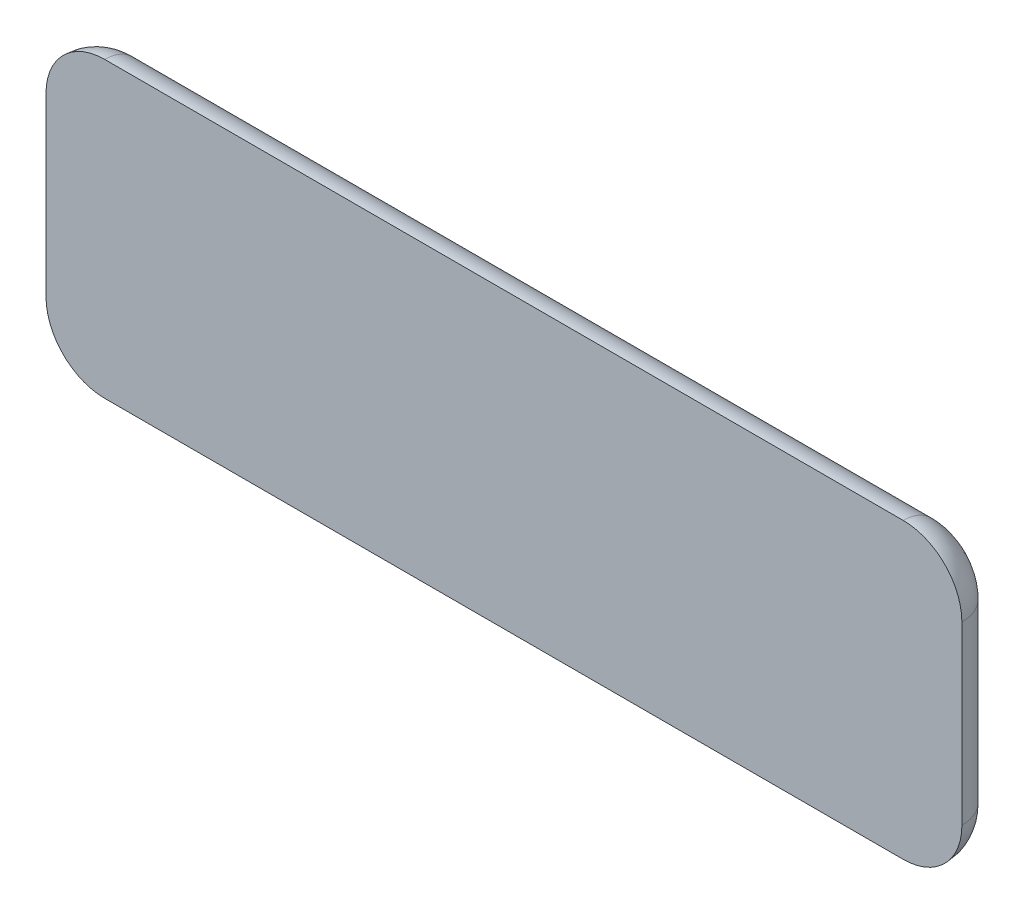
ISO-10303-21;
HEADER;
FILE_DESCRIPTION(('STEP AP214'),'2;1');
FILE_NAME('part.step','',(''),(''),'','','');
FILE_SCHEMA(('AUTOMOTIVE_DESIGN { 1 0 10303 214 1 1 1 1 }'));
ENDSEC;
DATA;
#1=APPLICATION_CONTEXT('core data for automotive mechanical design processes');
#2=APPLICATION_PROTOCOL_DEFINITION('international standard','automotive_design',2000,#1);
#3=PRODUCT_CONTEXT('',#1,'mechanical');
#4=PRODUCT('Part','Part','',(#3));
#5=PRODUCT_RELATED_PRODUCT_CATEGORY('part','',(#4));
#6=PRODUCT_DEFINITION_FORMATION('','',#4);
#7=PRODUCT_DEFINITION_CONTEXT('part definition',#1,'design');
#8=PRODUCT_DEFINITION('design','',#6,#7);
#9=PRODUCT_DEFINITION_SHAPE('','',#8);
#10=(LENGTH_UNIT() NAMED_UNIT(*) SI_UNIT(.MILLI.,.METRE.));
#11=(NAMED_UNIT(*) PLANE_ANGLE_UNIT() SI_UNIT($,.RADIAN.));
#12=(NAMED_UNIT(*) SI_UNIT($,.STERADIAN.) SOLID_ANGLE_UNIT());
#13=UNCERTAINTY_MEASURE_WITH_UNIT(LENGTH_MEASURE(1.E-05),#10,'distance_accuracy_value','');
#14=(GEOMETRIC_REPRESENTATION_CONTEXT(3) GLOBAL_UNCERTAINTY_ASSIGNED_CONTEXT((#13)) GLOBAL_UNIT_ASSIGNED_CONTEXT((#10,
#11,#12)) REPRESENTATION_CONTEXT('',''));
#15=CARTESIAN_POINT('',(0.,0.,0.));
#16=DIRECTION('',(0.,0.,1.));
#17=DIRECTION('',(1.,0.,0.));
#18=AXIS2_PLACEMENT_3D('',#15,#16,#17);
#19=CARTESIAN_POINT('',(-1.02,1.35,0.));
#20=DIRECTION('',(0.,0.,-1.));
#21=DIRECTION('',(0.,-1.,0.));
#22=AXIS2_PLACEMENT_3D('',#19,#20,#21);
#23=PLANE('',#22);
#24=CARTESIAN_POINT('',(-1.02,1.35,0.));
#25=DIRECTION('',(0.,0.,-1.));
#26=DIRECTION('',(-1.,0.,0.));
#27=AXIS2_PLACEMENT_3D('',#24,#25,#26);
#28=CIRCLE('',#27,0.05);
#29=CARTESIAN_POINT('',(-1.07,1.35,0.));
#30=VERTEX_POINT('',#29);
#31=CARTESIAN_POINT('',(-1.02,1.4,0.));
#32=VERTEX_POINT('',#31);
#33=EDGE_CURVE('E157',#30,#32,#28,.T.);
#34=ORIENTED_EDGE('',*,*,#33,.T.);
#35=DIRECTION('',(-1.,0.,0.));
#36=VECTOR('',#35,1.);
#37=CARTESIAN_POINT('',(1.02,1.4,0.));
#38=LINE('',#37,#36);
#39=CARTESIAN_POINT('',(1.02,1.4,0.));
#40=VERTEX_POINT('',#39);
#41=EDGE_CURVE('E11',#40,#32,#38,.T.);
#42=ORIENTED_EDGE('',*,*,#41,.F.);
#43=CARTESIAN_POINT('',(1.02,1.35,0.));
#44=DIRECTION('',(0.,0.,-1.));
#45=DIRECTION('',(0.,1.,0.));
#46=AXIS2_PLACEMENT_3D('',#43,#44,#45);
#47=CIRCLE('',#46,0.05);
#48=CARTESIAN_POINT('',(1.07,1.35,0.));
#49=VERTEX_POINT('',#48);
#50=EDGE_CURVE('E140',#40,#49,#47,.T.);
#51=ORIENTED_EDGE('',*,*,#50,.T.);
#52=DIRECTION('',(0.,1.,0.));
#53=VECTOR('',#52,1.);
#54=CARTESIAN_POINT('',(1.07,0.9,0.));
#55=LINE('',#54,#53);
#56=CARTESIAN_POINT('',(1.07,0.9,0.));
#57=VERTEX_POINT('',#56);
#58=EDGE_CURVE('E141',#57,#49,#55,.T.);
#59=ORIENTED_EDGE('',*,*,#58,.F.);
#60=CARTESIAN_POINT('',(1.02,0.9,0.));
#61=DIRECTION('',(0.,0.,-1.));
#62=DIRECTION('',(1.,0.,0.));
#63=AXIS2_PLACEMENT_3D('',#60,#61,#62);
#64=CIRCLE('',#63,0.05);
#65=CARTESIAN_POINT('',(1.02,0.85,0.));
#66=VERTEX_POINT('',#65);
#67=EDGE_CURVE('E100',#57,#66,#64,.T.);
#68=ORIENTED_EDGE('',*,*,#67,.T.);
#69=DIRECTION('',(1.,0.,0.));
#70=VECTOR('',#69,1.);
#71=CARTESIAN_POINT('',(-1.02,0.85,0.));
#72=LINE('',#71,#70);
#73=CARTESIAN_POINT('',(-1.02,0.85,0.));
#74=VERTEX_POINT('',#73);
#75=EDGE_CURVE('E93',#74,#66,#72,.T.);
#76=ORIENTED_EDGE('',*,*,#75,.F.);
#77=CARTESIAN_POINT('',(-1.02,0.9,0.));
#78=DIRECTION('',(0.,0.,-1.));
#79=DIRECTION('',(0.,-1.,0.));
#80=AXIS2_PLACEMENT_3D('',#77,#78,#79);
#81=CIRCLE('',#80,0.05);
#82=CARTESIAN_POINT('',(-1.07,0.9,0.));
#83=VERTEX_POINT('',#82);
#84=EDGE_CURVE('E96',#74,#83,#81,.T.);
#85=ORIENTED_EDGE('',*,*,#84,.T.);
#86=DIRECTION('',(0.,-1.,0.));
#87=VECTOR('',#86,1.);
#88=CARTESIAN_POINT('',(-1.07,1.35,0.));
#89=LINE('',#88,#87);
#90=EDGE_CURVE('E125',#30,#83,#89,.T.);
#91=ORIENTED_EDGE('',*,*,#90,.F.);
#92=EDGE_LOOP('',(#34,#42,#51,#59,#68,#76,#85,#91));
#93=FACE_BOUND('',#92,.T.);
#94=ADVANCED_FACE('F17',(#93),#23,.T.);
#95=CARTESIAN_POINT('',(-1.02,1.4,0.1));
#96=DIRECTION('',(-1.,0.,0.));
#97=DIRECTION('',(0.,0.,1.));
#98=AXIS2_PLACEMENT_3D('',#95,#96,#97);
#99=CYLINDRICAL_SURFACE('',#98,0.1);
#100=DIRECTION('',(1.,0.,0.));
#101=VECTOR('',#100,1.);
#102=CARTESIAN_POINT('',(-1.02,1.5,0.1));
#103=LINE('',#102,#101);
#104=CARTESIAN_POINT('',(-1.02,1.5,0.1));
#105=VERTEX_POINT('',#104);
#106=CARTESIAN_POINT('',(1.02,1.5,0.1));
#107=VERTEX_POINT('',#106);
#108=EDGE_CURVE('E146',#105,#107,#103,.T.);
#109=ORIENTED_EDGE('',*,*,#108,.T.);
#110=CARTESIAN_POINT('',(1.02,1.4,0.1));
#111=DIRECTION('',(1.,0.,0.));
#112=DIRECTION('',(0.,0.,-1.));
#113=AXIS2_PLACEMENT_3D('',#110,#111,#112);
#114=CIRCLE('',#113,0.1);
#115=EDGE_CURVE('E26',#40,#107,#114,.T.);
#116=ORIENTED_EDGE('',*,*,#115,.F.);
#117=ORIENTED_EDGE('',*,*,#41,.T.);
#118=CARTESIAN_POINT('',(-1.02,1.4,0.1));
#119=DIRECTION('',(-1.,0.,0.));
#120=DIRECTION('',(0.,1.,0.));
#121=AXIS2_PLACEMENT_3D('',#118,#119,#120);
#122=CIRCLE('',#121,0.1);
#123=EDGE_CURVE('E150',#105,#32,#122,.T.);
#124=ORIENTED_EDGE('',*,*,#123,.F.);
#125=EDGE_LOOP('',(#109,#116,#117,#124));
#126=FACE_BOUND('',#125,.T.);
#127=ADVANCED_FACE('F184',(#126),#99,.T.);
#128=CARTESIAN_POINT('',(1.06999999999983,1.35,0.));
#129=CARTESIAN_POINT('',(1.07000000000037,1.40000000000037,1.74865002631021E-13));
#130=CARTESIAN_POINT('',(1.02,1.39999999999954,-1.71437844891222E-13));
#131=CARTESIAN_POINT('',(1.17000000000029,1.34999999999892,0.));
#132=CARTESIAN_POINT('',(1.1700000000019,1.5000000000025,5.85637090580259E-13));
#133=CARTESIAN_POINT('',(1.01999999999833,1.49999999999999,-4.53268615543802E-13));
#134=CARTESIAN_POINT('',(1.17000000000007,1.34999999999851,0.100000000000413));
#135=CARTESIAN_POINT('',(1.17000000000168,1.50000000000255,0.100000000001039));
#136=CARTESIAN_POINT('',(1.01999999999764,1.50000000000005,0.1));
#137=(BOUNDED_SURFACE() B_SPLINE_SURFACE(2,2,((#128,#129,#130),(#131,#132,#133),(#134,#135,
#136)),.UNSPECIFIED.,.F.,.F.,.F.) B_SPLINE_SURFACE_WITH_KNOTS((3,3),(3,3),(-1.57079632680189,
-4.74374763252051E-12),(-1.07638072739206E-11,1.57079632681159),
.UNSPECIFIED.) GEOMETRIC_REPRESENTATION_ITEM() RATIONAL_B_SPLINE_SURFACE(((1.,0.707106781176839,
1.),(0.707106781185754,0.499999999992574,0.707106781185754),(1.,0.707106781176839,1.))) REPRESENTATION_ITEM('') SURFACE());
#138=CARTESIAN_POINT('',(1.02,1.35,0.1));
#139=DIRECTION('',(0.,0.,1.));
#140=DIRECTION('',(1.,0.,0.));
#141=AXIS2_PLACEMENT_3D('',#138,#139,#140);
#142=CIRCLE('',#141,0.15);
#143=CARTESIAN_POINT('',(1.17,1.35,0.1));
#144=VERTEX_POINT('',#143);
#145=EDGE_CURVE('E145',#144,#107,#142,.T.);
#146=CARTESIAN_POINT('',(1.07,1.35,0.1));
#147=DIRECTION('',(0.,1.,0.));
#148=DIRECTION('',(1.,0.,0.));
#149=AXIS2_PLACEMENT_3D('',#146,#147,#148);
#150=CIRCLE('',#149,0.1);
#151=EDGE_CURVE('E136',#144,#49,#150,.T.);
#152=ORIENTED_EDGE('',*,*,#50,.F.);
#153=ORIENTED_EDGE('',*,*,#115,.T.);
#154=ORIENTED_EDGE('',*,*,#145,.F.);
#155=ORIENTED_EDGE('',*,*,#151,.T.);
#156=EDGE_LOOP('',(#152,#153,#154,#155));
#157=FACE_BOUND('',#156,.T.);
#158=ADVANCED_FACE('F180',(#157),#137,.F.);
#159=CARTESIAN_POINT('',(1.07,1.35,0.1));
#160=DIRECTION('',(0.,1.,0.));
#161=DIRECTION('',(0.,0.,1.));
#162=AXIS2_PLACEMENT_3D('',#159,#160,#161);
#163=CYLINDRICAL_SURFACE('',#162,0.1);
#164=ORIENTED_EDGE('',*,*,#58,.T.);
#165=ORIENTED_EDGE('',*,*,#151,.F.);
#166=DIRECTION('',(0.,-1.,0.));
#167=VECTOR('',#166,1.);
#168=CARTESIAN_POINT('',(1.17,1.35,0.1));
#169=LINE('',#168,#167);
#170=CARTESIAN_POINT('',(1.17,0.9,0.1));
#171=VERTEX_POINT('',#170);
#172=EDGE_CURVE('E135',#144,#171,#169,.T.);
#173=ORIENTED_EDGE('',*,*,#172,.T.);
#174=CARTESIAN_POINT('',(1.07,0.9,0.1));
#175=DIRECTION('',(0.,-1.,0.));
#176=DIRECTION('',(0.,0.,-1.));
#177=AXIS2_PLACEMENT_3D('',#174,#175,#176);
#178=CIRCLE('',#177,0.1);
#179=EDGE_CURVE('E169',#57,#171,#178,.T.);
#180=ORIENTED_EDGE('',*,*,#179,.F.);
#181=EDGE_LOOP('',(#164,#165,#173,#180));
#182=FACE_BOUND('',#181,.T.);
#183=ADVANCED_FACE('F192',(#182),#163,.T.);
#184=CARTESIAN_POINT('',(1.02,0.850000000000156,0.));
#185=CARTESIAN_POINT('',(1.07000000000036,0.849999999999641,1.71873122544806E-13));
#186=CARTESIAN_POINT('',(1.06999999999954,0.9,-1.70159025764169E-13));
#187=CARTESIAN_POINT('',(1.01999999999897,0.749999999999704,0.));
#188=CARTESIAN_POINT('',(1.17000000000245,0.749999999998161,5.73835123191807E-13));
#189=CARTESIAN_POINT('',(1.16999999999999,0.900000000001639,-4.52261321751552E-13));
#190=CARTESIAN_POINT('',(1.01999999999857,0.749999999999927,0.10000000000042));
#191=CARTESIAN_POINT('',(1.17000000000251,0.749999999998384,0.100000000001026));
#192=CARTESIAN_POINT('',(1.17000000000005,0.900000000002323,0.1));
#193=(BOUNDED_SURFACE() B_SPLINE_SURFACE(2,2,((#184,#185,#186),(#187,#188,#189),(#190,#191,
#192)),.UNSPECIFIED.,.F.,.F.,.F.) B_SPLINE_SURFACE_WITH_KNOTS((3,3),(3,3),(-1.57079632680176,
-4.60683114072441E-12),(-1.57079632680519,1.63846789972904E-11),
.UNSPECIFIED.) GEOMETRIC_REPRESENTATION_ITEM() RATIONAL_B_SPLINE_SURFACE(((1.,0.707106781177116,
1.),(0.70710678118575,0.499999999992767,0.70710678118575),(1.,0.707106781177116,1.))) REPRESENTATION_ITEM('') SURFACE());
#194=CARTESIAN_POINT('',(1.02,0.9,0.1));
#195=DIRECTION('',(0.,0.,1.));
#196=DIRECTION('',(0.,-1.,0.));
#197=AXIS2_PLACEMENT_3D('',#194,#195,#196);
#198=CIRCLE('',#197,0.15);
#199=CARTESIAN_POINT('',(1.02,0.75,0.1));
#200=VERTEX_POINT('',#199);
#201=EDGE_CURVE('E131',#200,#171,#198,.T.);
#202=CARTESIAN_POINT('',(1.02,0.85,0.1));
#203=DIRECTION('',(1.,0.,0.));
#204=DIRECTION('',(0.,-1.,0.));
#205=AXIS2_PLACEMENT_3D('',#202,#203,#204);
#206=CIRCLE('',#205,0.1);
#207=EDGE_CURVE('E104',#200,#66,#206,.T.);
#208=ORIENTED_EDGE('',*,*,#67,.F.);
#209=ORIENTED_EDGE('',*,*,#179,.T.);
#210=ORIENTED_EDGE('',*,*,#201,.F.);
#211=ORIENTED_EDGE('',*,*,#207,.T.);
#212=EDGE_LOOP('',(#208,#209,#210,#211));
#213=FACE_BOUND('',#212,.T.);
#214=ADVANCED_FACE('F259',(#213),#193,.F.);
#215=CARTESIAN_POINT('',(-1.02,0.85,0.1));
#216=DIRECTION('',(1.,0.,0.));
#217=DIRECTION('',(0.,0.,-1.));
#218=AXIS2_PLACEMENT_3D('',#215,#216,#217);
#219=CYLINDRICAL_SURFACE('',#218,0.1);
#220=DIRECTION('',(-1.,0.,0.));
#221=VECTOR('',#220,1.);
#222=CARTESIAN_POINT('',(1.02,0.75,0.1));
#223=LINE('',#222,#221);
#224=CARTESIAN_POINT('',(-1.02,0.75,0.1));
#225=VERTEX_POINT('',#224);
#226=EDGE_CURVE('E110',#200,#225,#223,.T.);
#227=ORIENTED_EDGE('',*,*,#226,.T.);
#228=CARTESIAN_POINT('',(-1.02,0.85,0.1));
#229=DIRECTION('',(-1.,0.,0.));
#230=DIRECTION('',(0.,0.,-1.));
#231=AXIS2_PLACEMENT_3D('',#228,#229,#230);
#232=CIRCLE('',#231,0.1);
#233=EDGE_CURVE('E105',#74,#225,#232,.T.);
#234=ORIENTED_EDGE('',*,*,#233,.F.);
#235=ORIENTED_EDGE('',*,*,#75,.T.);
#236=ORIENTED_EDGE('',*,*,#207,.F.);
#237=EDGE_LOOP('',(#227,#234,#235,#236));
#238=FACE_BOUND('',#237,.T.);
#239=ADVANCED_FACE('F108',(#238),#219,.T.);
#240=CARTESIAN_POINT('',(-1.06999999999984,0.9,0.));
#241=CARTESIAN_POINT('',(-1.07000000000037,0.849999999999633,1.74148144477259E-13));
#242=CARTESIAN_POINT('',(-1.02,0.850000000000463,-1.71165910663479E-13));
#243=CARTESIAN_POINT('',(-1.17000000000029,0.900000000001056,0.));
#244=CARTESIAN_POINT('',(-1.17000000000188,0.749999999997521,5.81912087217422E-13));
#245=CARTESIAN_POINT('',(-1.01999999999834,0.750000000000009,-4.54048758458664E-13));
#246=CARTESIAN_POINT('',(-1.17000000000007,0.900000000001469,0.100000000000417));
#247=CARTESIAN_POINT('',(-1.17000000000166,0.749999999997464,0.100000000001036));
#248=CARTESIAN_POINT('',(-1.01999999999765,0.749999999999952,0.1));
#249=(BOUNDED_SURFACE() B_SPLINE_SURFACE(2,2,((#240,#241,#242),(#243,#244,#245),(#246,#247,
#248)),.UNSPECIFIED.,.F.,.F.,.F.) B_SPLINE_SURFACE_WITH_KNOTS((3,3),(3,3),(-1.57079632680185,
-4.69396589525162E-12),(-3.14159265360035,-1.57079632677831),
.UNSPECIFIED.) GEOMETRIC_REPRESENTATION_ITEM() RATIONAL_B_SPLINE_SURFACE(((1.,0.707106781176951,
1.),(0.707106781185749,0.49999999999265,0.707106781185749),(1.,0.707106781176951,1.))) REPRESENTATION_ITEM('') SURFACE());
#250=CARTESIAN_POINT('',(-1.02,0.9,0.1));
#251=DIRECTION('',(0.,0.,1.));
#252=DIRECTION('',(-1.,0.,0.));
#253=AXIS2_PLACEMENT_3D('',#250,#251,#252);
#254=CIRCLE('',#253,0.15);
#255=CARTESIAN_POINT('',(-1.17,0.9,0.1));
#256=VERTEX_POINT('',#255);
#257=EDGE_CURVE('E128',#256,#225,#254,.T.);
#258=CARTESIAN_POINT('',(-1.07,0.9,0.1));
#259=DIRECTION('',(0.,-1.,0.));
#260=DIRECTION('',(-1.,0.,0.));
#261=AXIS2_PLACEMENT_3D('',#258,#259,#260);
#262=CIRCLE('',#261,0.1);
#263=EDGE_CURVE('E117',#256,#83,#262,.T.);
#264=ORIENTED_EDGE('',*,*,#257,.F.);
#265=ORIENTED_EDGE('',*,*,#263,.T.);
#266=ORIENTED_EDGE('',*,*,#84,.F.);
#267=ORIENTED_EDGE('',*,*,#233,.T.);
#268=EDGE_LOOP('',(#264,#265,#266,#267));
#269=FACE_BOUND('',#268,.T.);
#270=ADVANCED_FACE('F116',(#269),#249,.F.);
#271=CARTESIAN_POINT('',(-1.07,1.35,0.1));
#272=DIRECTION('',(0.,-1.,0.));
#273=DIRECTION('',(0.,0.,-1.));
#274=AXIS2_PLACEMENT_3D('',#271,#272,#273);
#275=CYLINDRICAL_SURFACE('',#274,0.1);
#276=DIRECTION('',(0.,1.,0.));
#277=VECTOR('',#276,1.);
#278=CARTESIAN_POINT('',(-1.17,0.9,0.1));
#279=LINE('',#278,#277);
#280=CARTESIAN_POINT('',(-1.17,1.35,0.1));
#281=VERTEX_POINT('',#280);
#282=EDGE_CURVE('E266',#256,#281,#279,.T.);
#283=ORIENTED_EDGE('',*,*,#282,.T.);
#284=CARTESIAN_POINT('',(-1.07,1.35,0.1));
#285=DIRECTION('',(0.,1.,0.));
#286=DIRECTION('',(0.,0.,-1.));
#287=AXIS2_PLACEMENT_3D('',#284,#285,#286);
#288=CIRCLE('',#287,0.1);
#289=EDGE_CURVE('E161',#30,#281,#288,.T.);
#290=ORIENTED_EDGE('',*,*,#289,.F.);
#291=ORIENTED_EDGE('',*,*,#90,.T.);
#292=ORIENTED_EDGE('',*,*,#263,.F.);
#293=EDGE_LOOP('',(#283,#290,#291,#292));
#294=FACE_BOUND('',#293,.T.);
#295=ADVANCED_FACE('F277',(#294),#275,.T.);
#296=CARTESIAN_POINT('',(-1.02,1.39999999999984,0.));
#297=CARTESIAN_POINT('',(-1.07000000000037,1.40000000000037,1.73637868865119E-13));
#298=CARTESIAN_POINT('',(-1.06999999999954,1.35,-1.71269248788898E-13));
#299=CARTESIAN_POINT('',(-1.01999999999895,1.50000000000029,0.));
#300=CARTESIAN_POINT('',(-1.17000000000247,1.50000000000187,5.81146504736385E-13));
#301=CARTESIAN_POINT('',(-1.16999999999999,1.34999999999834,-4.53574848242432E-13));
#302=CARTESIAN_POINT('',(-1.01999999999853,1.50000000000007,0.100000000000416));
#303=CARTESIAN_POINT('',(-1.17000000000253,1.50000000000165,0.100000000001035));
#304=CARTESIAN_POINT('',(-1.17000000000005,1.34999999999766,0.1));
#305=(BOUNDED_SURFACE() B_SPLINE_SURFACE(2,2,((#296,#297,#298),(#299,#300,#301),(#302,#303,
#304)),.UNSPECIFIED.,.F.,.F.,.F.) B_SPLINE_SURFACE_WITH_KNOTS((3,3),(3,3),(-1.57079632680184,
-4.68978894567417E-12),(1.57079632678437,3.14159265360634),
.UNSPECIFIED.) GEOMETRIC_REPRESENTATION_ITEM() RATIONAL_B_SPLINE_SURFACE(((1.,0.707106781176974,
1.),(0.707106781185749,0.499999999992666,0.707106781185749),(1.,0.707106781176974,1.))) REPRESENTATION_ITEM('') SURFACE());
#306=CARTESIAN_POINT('',(-1.02,1.35,0.1));
#307=DIRECTION('',(0.,0.,1.));
#308=DIRECTION('',(0.,1.,0.));
#309=AXIS2_PLACEMENT_3D('',#306,#307,#308);
#310=CIRCLE('',#309,0.15);
#311=EDGE_CURVE('E269',#105,#281,#310,.T.);
#312=ORIENTED_EDGE('',*,*,#311,.F.);
#313=ORIENTED_EDGE('',*,*,#123,.T.);
#314=ORIENTED_EDGE('',*,*,#33,.F.);
#315=ORIENTED_EDGE('',*,*,#289,.T.);
#316=EDGE_LOOP('',(#312,#313,#314,#315));
#317=FACE_BOUND('',#316,.T.);
#318=ADVANCED_FACE('F280',(#317),#305,.F.);
#319=CARTESIAN_POINT('',(-1.02,1.35,0.1));
#320=DIRECTION('',(0.,0.,-1.));
#321=DIRECTION('',(0.,-1.,0.));
#322=AXIS2_PLACEMENT_3D('',#319,#320,#321);
#323=PLANE('',#322);
#324=ORIENTED_EDGE('',*,*,#311,.T.);
#325=ORIENTED_EDGE('',*,*,#282,.F.);
#326=ORIENTED_EDGE('',*,*,#257,.T.);
#327=ORIENTED_EDGE('',*,*,#226,.F.);
#328=ORIENTED_EDGE('',*,*,#201,.T.);
#329=ORIENTED_EDGE('',*,*,#172,.F.);
#330=ORIENTED_EDGE('',*,*,#145,.T.);
#331=ORIENTED_EDGE('',*,*,#108,.F.);
#332=EDGE_LOOP('',(#324,#325,#326,#327,#328,#329,#330,#331));
#333=FACE_BOUND('',#332,.T.);
#334=ADVANCED_FACE('F188',(#333),#323,.F.);
#335=CLOSED_SHELL('',(#94,#127,#158,#183,#214,#239,#270,#295,#318,#334));
#336=MANIFOLD_SOLID_BREP('B1',#335);
#337=ADVANCED_BREP_SHAPE_REPRESENTATION('',(#18,#336),#14);
#338=SHAPE_DEFINITION_REPRESENTATION(#9,#337);
ENDSEC;
END-ISO-10303-21;
